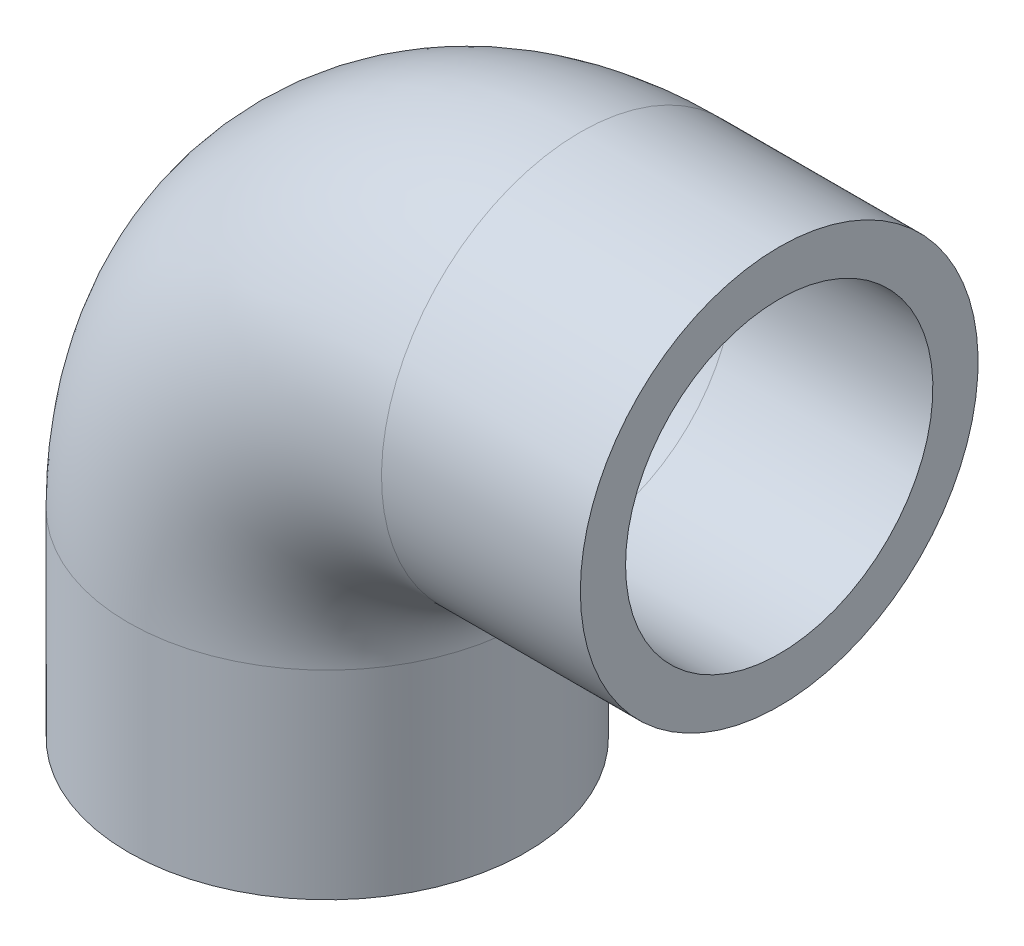
ISO-10303-21;
HEADER;
FILE_DESCRIPTION(('STEP AP214'),'2;1');
FILE_NAME('part.step','',(''),(''),'','','');
FILE_SCHEMA(('AUTOMOTIVE_DESIGN { 1 0 10303 214 1 1 1 1 }'));
ENDSEC;
DATA;
#1=APPLICATION_CONTEXT('core data for automotive mechanical design processes');
#2=APPLICATION_PROTOCOL_DEFINITION('international standard','automotive_design',2000,#1);
#3=PRODUCT_CONTEXT('',#1,'mechanical');
#4=PRODUCT('Part','Part','',(#3));
#5=PRODUCT_RELATED_PRODUCT_CATEGORY('part','',(#4));
#6=PRODUCT_DEFINITION_FORMATION('','',#4);
#7=PRODUCT_DEFINITION_CONTEXT('part definition',#1,'design');
#8=PRODUCT_DEFINITION('design','',#6,#7);
#9=PRODUCT_DEFINITION_SHAPE('','',#8);
#10=(LENGTH_UNIT() NAMED_UNIT(*) SI_UNIT(.MILLI.,.METRE.));
#11=(NAMED_UNIT(*) PLANE_ANGLE_UNIT() SI_UNIT($,.RADIAN.));
#12=(NAMED_UNIT(*) SI_UNIT($,.STERADIAN.) SOLID_ANGLE_UNIT());
#13=UNCERTAINTY_MEASURE_WITH_UNIT(LENGTH_MEASURE(1.E-05),#10,'distance_accuracy_value','');
#14=(GEOMETRIC_REPRESENTATION_CONTEXT(3) GLOBAL_UNCERTAINTY_ASSIGNED_CONTEXT((#13)) GLOBAL_UNIT_ASSIGNED_CONTEXT((#10,
#11,#12)) REPRESENTATION_CONTEXT('',''));
#15=CARTESIAN_POINT('',(0.,0.,0.));
#16=DIRECTION('',(0.,0.,1.));
#17=DIRECTION('',(1.,0.,0.));
#18=AXIS2_PLACEMENT_3D('',#15,#16,#17);
#19=CARTESIAN_POINT('',(0.,0.,0.));
#20=DIRECTION('',(0.,-1.,0.));
#21=DIRECTION('',(0.,0.,1.));
#22=AXIS2_PLACEMENT_3D('',#19,#20,#21);
#23=PLANE('',#22);
#24=CARTESIAN_POINT('',(0.,0.,0.));
#25=DIRECTION('',(0.,-1.,0.));
#26=DIRECTION('',(0.,0.,-1.));
#27=AXIS2_PLACEMENT_3D('',#24,#25,#26);
#28=CIRCLE('',#27,10.795);
#29=CARTESIAN_POINT('',(0.,0.,-10.795));
#30=VERTEX_POINT('',#29);
#31=EDGE_CURVE('E105',#30,#30,#28,.T.);
#32=ORIENTED_EDGE('',*,*,#31,.F.);
#33=EDGE_LOOP('',(#32));
#34=FACE_BOUND('',#33,.T.);
#35=CARTESIAN_POINT('',(0.,0.,0.));
#36=DIRECTION('',(0.,-1.,0.));
#37=DIRECTION('',(0.,0.,1.));
#38=AXIS2_PLACEMENT_3D('',#35,#36,#37);
#39=CIRCLE('',#38,13.97);
#40=CARTESIAN_POINT('',(0.,0.,13.97));
#41=VERTEX_POINT('',#40);
#42=EDGE_CURVE('E58',#41,#41,#39,.T.);
#43=ORIENTED_EDGE('',*,*,#42,.T.);
#44=EDGE_LOOP('',(#43));
#45=FACE_BOUND('',#44,.T.);
#46=ADVANCED_FACE('F46',(#34,#45),#23,.T.);
#47=CARTESIAN_POINT('',(31.75,31.75,0.));
#48=DIRECTION('',(-1.,0.,0.));
#49=DIRECTION('',(0.,0.,1.));
#50=AXIS2_PLACEMENT_3D('',#47,#48,#49);
#51=PLANE('',#50);
#52=CARTESIAN_POINT('',(31.75,31.75,0.));
#53=DIRECTION('',(-1.,0.,0.));
#54=DIRECTION('',(0.,0.,1.));
#55=AXIS2_PLACEMENT_3D('',#52,#53,#54);
#56=CIRCLE('',#55,10.795);
#57=CARTESIAN_POINT('',(31.75,31.75,10.795));
#58=VERTEX_POINT('',#57);
#59=EDGE_CURVE('E107',#58,#58,#56,.T.);
#60=ORIENTED_EDGE('',*,*,#59,.T.);
#61=EDGE_LOOP('',(#60));
#62=FACE_BOUND('',#61,.T.);
#63=CARTESIAN_POINT('',(31.75,31.75,0.));
#64=DIRECTION('',(-1.,0.,0.));
#65=DIRECTION('',(0.,0.,1.));
#66=AXIS2_PLACEMENT_3D('',#63,#64,#65);
#67=CIRCLE('',#66,13.97);
#68=CARTESIAN_POINT('',(31.75,31.75,13.97));
#69=VERTEX_POINT('',#68);
#70=EDGE_CURVE('E12',#69,#69,#67,.T.);
#71=ORIENTED_EDGE('',*,*,#70,.F.);
#72=EDGE_LOOP('',(#71));
#73=FACE_BOUND('',#72,.T.);
#74=ADVANCED_FACE('F64',(#62,#73),#51,.F.);
#75=CARTESIAN_POINT('',(0.,0.,0.));
#76=DIRECTION('',(0.,1.,0.));
#77=DIRECTION('',(0.,0.,1.));
#78=AXIS2_PLACEMENT_3D('',#75,#76,#77);
#79=CYLINDRICAL_SURFACE('',#78,13.97);
#80=CARTESIAN_POINT('',(0.,13.97,0.));
#81=DIRECTION('',(0.,-1.,0.));
#82=DIRECTION('',(0.,0.,1.));
#83=AXIS2_PLACEMENT_3D('',#80,#81,#82);
#84=CIRCLE('',#83,13.97);
#85=CARTESIAN_POINT('',(-13.97,13.97,0.));
#86=VERTEX_POINT('',#85);
#87=EDGE_CURVE('E114',#86,#86,#84,.T.);
#88=ORIENTED_EDGE('',*,*,#87,.T.);
#89=EDGE_LOOP('',(#88));
#90=FACE_BOUND('',#89,.T.);
#91=ORIENTED_EDGE('',*,*,#42,.F.);
#92=EDGE_LOOP('',(#91));
#93=FACE_BOUND('',#92,.T.);
#94=ADVANCED_FACE('F66',(#90,#93),#79,.T.);
#95=CARTESIAN_POINT('',(17.78,13.97,0.));
#96=DIRECTION('',(0.,0.,-1.));
#97=DIRECTION('',(-1.,0.,0.));
#98=AXIS2_PLACEMENT_3D('',#95,#96,#97);
#99=TOROIDAL_SURFACE('',#98,17.78,13.97);
#100=CARTESIAN_POINT('',(17.78,31.75,0.));
#101=DIRECTION('',(-1.,0.,0.));
#102=DIRECTION('',(0.,0.,1.));
#103=AXIS2_PLACEMENT_3D('',#100,#101,#102);
#104=CIRCLE('',#103,13.97);
#105=CARTESIAN_POINT('',(17.78,45.72,0.));
#106=VERTEX_POINT('',#105);
#107=EDGE_CURVE('E53',#106,#106,#104,.T.);
#108=CARTESIAN_POINT('',(17.78,13.97,0.));
#109=DIRECTION('',(0.,0.,-1.));
#110=DIRECTION('',(-1.,0.,0.));
#111=AXIS2_PLACEMENT_3D('',#108,#109,#110);
#112=CIRCLE('',#111,31.75);
#113=EDGE_CURVE('',#86,#106,#112,.T.);
#114=ORIENTED_EDGE('',*,*,#87,.F.);
#115=ORIENTED_EDGE('',*,*,#107,.T.);
#116=ORIENTED_EDGE('',*,*,#113,.T.);
#117=ORIENTED_EDGE('',*,*,#113,.F.);
#118=EDGE_LOOP('',(#114,#116,#115,#117));
#119=FACE_BOUND('',#118,.T.);
#120=ADVANCED_FACE('F72',(#119),#99,.T.);
#121=CARTESIAN_POINT('',(17.78,31.75,0.));
#122=DIRECTION('',(1.,0.,0.));
#123=DIRECTION('',(0.,0.,-1.));
#124=AXIS2_PLACEMENT_3D('',#121,#122,#123);
#125=CYLINDRICAL_SURFACE('',#124,13.97);
#126=ORIENTED_EDGE('',*,*,#70,.T.);
#127=EDGE_LOOP('',(#126));
#128=FACE_BOUND('',#127,.T.);
#129=ORIENTED_EDGE('',*,*,#107,.F.);
#130=EDGE_LOOP('',(#129));
#131=FACE_BOUND('',#130,.T.);
#132=ADVANCED_FACE('F61',(#128,#131),#125,.T.);
#133=CARTESIAN_POINT('',(0.,0.,0.));
#134=DIRECTION('',(0.,1.,0.));
#135=DIRECTION('',(0.,0.,1.));
#136=AXIS2_PLACEMENT_3D('',#133,#134,#135);
#137=CYLINDRICAL_SURFACE('',#136,10.795);
#138=CARTESIAN_POINT('',(0.,13.97,0.));
#139=DIRECTION('',(0.,1.,0.));
#140=DIRECTION('',(0.,0.,1.));
#141=AXIS2_PLACEMENT_3D('',#138,#139,#140);
#142=CIRCLE('',#141,10.795);
#143=CARTESIAN_POINT('',(-10.795,13.97,0.));
#144=VERTEX_POINT('',#143);
#145=EDGE_CURVE('E104',#144,#144,#142,.F.);
#146=ORIENTED_EDGE('',*,*,#145,.F.);
#147=EDGE_LOOP('',(#146));
#148=FACE_BOUND('',#147,.T.);
#149=ORIENTED_EDGE('',*,*,#31,.T.);
#150=EDGE_LOOP('',(#149));
#151=FACE_BOUND('',#150,.T.);
#152=ADVANCED_FACE('F80',(#148,#151),#137,.F.);
#153=CARTESIAN_POINT('',(17.78,13.97,0.));
#154=DIRECTION('',(0.,0.,-1.));
#155=DIRECTION('',(-1.,0.,0.));
#156=AXIS2_PLACEMENT_3D('',#153,#154,#155);
#157=TOROIDAL_SURFACE('',#156,17.78,10.795);
#158=CARTESIAN_POINT('',(17.78,31.75,0.));
#159=DIRECTION('',(-1.,0.,0.));
#160=DIRECTION('',(0.,-1.,0.));
#161=AXIS2_PLACEMENT_3D('',#158,#159,#160);
#162=CIRCLE('',#161,10.795);
#163=CARTESIAN_POINT('',(17.78,42.545,0.));
#164=VERTEX_POINT('',#163);
#165=EDGE_CURVE('E101',#164,#164,#162,.T.);
#166=CARTESIAN_POINT('',(17.78,13.97,0.));
#167=DIRECTION('',(0.,0.,-1.));
#168=DIRECTION('',(-1.,0.,0.));
#169=AXIS2_PLACEMENT_3D('',#166,#167,#168);
#170=CIRCLE('',#169,28.575);
#171=EDGE_CURVE('',#144,#164,#170,.T.);
#172=ORIENTED_EDGE('',*,*,#145,.T.);
#173=ORIENTED_EDGE('',*,*,#165,.F.);
#174=ORIENTED_EDGE('',*,*,#171,.T.);
#175=ORIENTED_EDGE('',*,*,#171,.F.);
#176=EDGE_LOOP('',(#172,#174,#173,#175));
#177=FACE_BOUND('',#176,.T.);
#178=ADVANCED_FACE('F85',(#177),#157,.F.);
#179=CARTESIAN_POINT('',(17.78,31.75,0.));
#180=DIRECTION('',(1.,0.,0.));
#181=DIRECTION('',(0.,0.,-1.));
#182=AXIS2_PLACEMENT_3D('',#179,#180,#181);
#183=CYLINDRICAL_SURFACE('',#182,10.795);
#184=ORIENTED_EDGE('',*,*,#59,.F.);
#185=EDGE_LOOP('',(#184));
#186=FACE_BOUND('',#185,.T.);
#187=ORIENTED_EDGE('',*,*,#165,.T.);
#188=EDGE_LOOP('',(#187));
#189=FACE_BOUND('',#188,.T.);
#190=ADVANCED_FACE('F76',(#186,#189),#183,.F.);
#191=CLOSED_SHELL('',(#46,#74,#94,#120,#132,#152,#178,#190));
#192=MANIFOLD_SOLID_BREP('B2',#191);
#193=ADVANCED_BREP_SHAPE_REPRESENTATION('',(#18,#192),#14);
#194=SHAPE_DEFINITION_REPRESENTATION(#9,#193);
ENDSEC;
END-ISO-10303-21;
